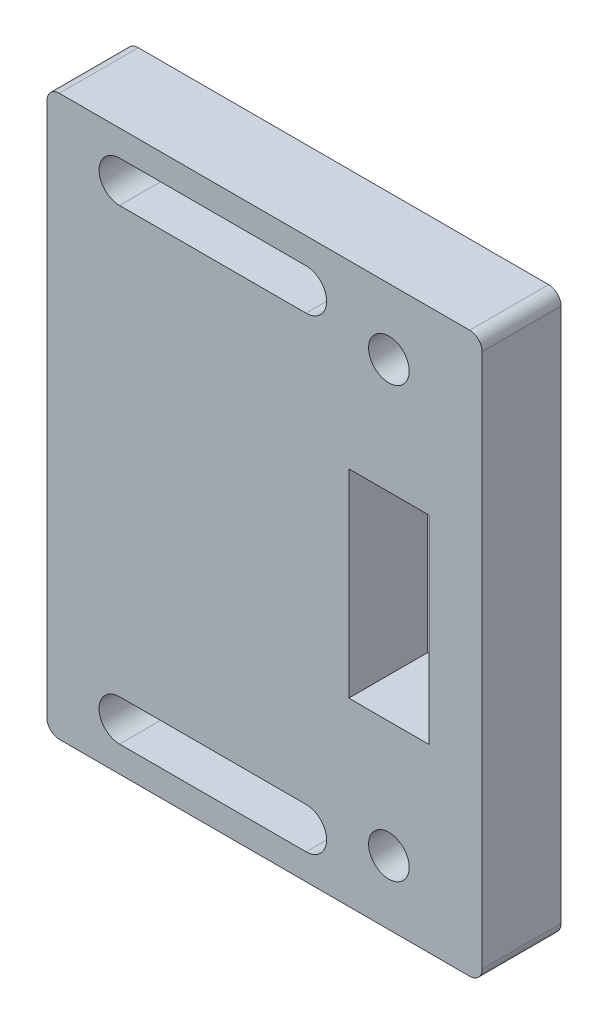
ISO-10303-21;
HEADER;
FILE_DESCRIPTION(('STEP AP214'),'2;1');
FILE_NAME('part.step','',(''),(''),'','','');
FILE_SCHEMA(('AUTOMOTIVE_DESIGN { 1 0 10303 214 1 1 1 1 }'));
ENDSEC;
DATA;
#1=APPLICATION_CONTEXT('core data for automotive mechanical design processes');
#2=APPLICATION_PROTOCOL_DEFINITION('international standard','automotive_design',2000,#1);
#3=PRODUCT_CONTEXT('',#1,'mechanical');
#4=PRODUCT('Part','Part','',(#3));
#5=PRODUCT_RELATED_PRODUCT_CATEGORY('part','',(#4));
#6=PRODUCT_DEFINITION_FORMATION('','',#4);
#7=PRODUCT_DEFINITION_CONTEXT('part definition',#1,'design');
#8=PRODUCT_DEFINITION('design','',#6,#7);
#9=PRODUCT_DEFINITION_SHAPE('','',#8);
#10=(LENGTH_UNIT() NAMED_UNIT(*) SI_UNIT(.MILLI.,.METRE.));
#11=(NAMED_UNIT(*) PLANE_ANGLE_UNIT() SI_UNIT($,.RADIAN.));
#12=(NAMED_UNIT(*) SI_UNIT($,.STERADIAN.) SOLID_ANGLE_UNIT());
#13=UNCERTAINTY_MEASURE_WITH_UNIT(LENGTH_MEASURE(1.E-05),#10,'distance_accuracy_value','');
#14=(GEOMETRIC_REPRESENTATION_CONTEXT(3) GLOBAL_UNCERTAINTY_ASSIGNED_CONTEXT((#13)) GLOBAL_UNIT_ASSIGNED_CONTEXT((#10,
#11,#12)) REPRESENTATION_CONTEXT('',''));
#15=CARTESIAN_POINT('',(0.,0.,0.));
#16=DIRECTION('',(0.,0.,1.));
#17=DIRECTION('',(1.,0.,0.));
#18=AXIS2_PLACEMENT_3D('',#15,#16,#17);
#19=CARTESIAN_POINT('',(0.,0.,12.7));
#20=DIRECTION('',(0.,0.,1.));
#21=DIRECTION('',(1.,0.,0.));
#22=AXIS2_PLACEMENT_3D('',#19,#20,#21);
#23=PLANE('',#22);
#24=DIRECTION('',(1.,0.,0.));
#25=VECTOR('',#24,1.);
#26=CARTESIAN_POINT('',(11.6874699313799,-79.215,12.7));
#27=LINE('',#26,#25);
#28=CARTESIAN_POINT('',(11.6874699313799,-79.215,12.7));
#29=VERTEX_POINT('',#28);
#30=CARTESIAN_POINT('',(41.6874699313799,-79.215,12.7));
#31=VERTEX_POINT('',#30);
#32=EDGE_CURVE('E179',#29,#31,#27,.T.);
#33=ORIENTED_EDGE('',*,*,#32,.T.);
#34=CARTESIAN_POINT('',(41.6874699313799,-82.515,12.7));
#35=DIRECTION('',(0.,0.,-1.));
#36=DIRECTION('',(-1.,0.,0.));
#37=AXIS2_PLACEMENT_3D('',#34,#35,#36);
#38=CIRCLE('',#37,3.3);
#39=CARTESIAN_POINT('',(41.6874699313799,-85.815,12.7));
#40=VERTEX_POINT('',#39);
#41=EDGE_CURVE('E190',#31,#40,#38,.T.);
#42=ORIENTED_EDGE('',*,*,#41,.T.);
#43=DIRECTION('',(-1.,0.,0.));
#44=VECTOR('',#43,1.);
#45=CARTESIAN_POINT('',(41.6874699313799,-85.815,12.7));
#46=LINE('',#45,#44);
#47=CARTESIAN_POINT('',(11.6874699313799,-85.815,12.7));
#48=VERTEX_POINT('',#47);
#49=EDGE_CURVE('E52',#40,#48,#46,.T.);
#50=ORIENTED_EDGE('',*,*,#49,.T.);
#51=CARTESIAN_POINT('',(11.6874699313799,-82.515,12.7));
#52=DIRECTION('',(0.,0.,-1.));
#53=DIRECTION('',(-1.,0.,0.));
#54=AXIS2_PLACEMENT_3D('',#51,#52,#53);
#55=CIRCLE('',#54,3.3);
#56=EDGE_CURVE('E187',#48,#29,#55,.T.);
#57=ORIENTED_EDGE('',*,*,#56,.T.);
#58=EDGE_LOOP('',(#33,#42,#50,#57));
#59=FACE_BOUND('',#58,.T.);
#60=DIRECTION('',(1.,0.,0.));
#61=VECTOR('',#60,1.);
#62=CARTESIAN_POINT('',(11.6874699313799,-4.185,12.7));
#63=LINE('',#62,#61);
#64=CARTESIAN_POINT('',(11.6874699313799,-4.185,12.7));
#65=VERTEX_POINT('',#64);
#66=CARTESIAN_POINT('',(41.6874699313799,-4.185,12.7));
#67=VERTEX_POINT('',#66);
#68=EDGE_CURVE('E229',#65,#67,#63,.T.);
#69=ORIENTED_EDGE('',*,*,#68,.T.);
#70=CARTESIAN_POINT('',(41.6874699313799,-7.485,12.7));
#71=DIRECTION('',(0.,0.,-1.));
#72=DIRECTION('',(-1.,0.,0.));
#73=AXIS2_PLACEMENT_3D('',#70,#71,#72);
#74=CIRCLE('',#73,3.3);
#75=CARTESIAN_POINT('',(41.6874699313799,-10.785,12.7));
#76=VERTEX_POINT('',#75);
#77=EDGE_CURVE('E239',#67,#76,#74,.T.);
#78=ORIENTED_EDGE('',*,*,#77,.T.);
#79=DIRECTION('',(1.,0.,0.));
#80=VECTOR('',#79,1.);
#81=CARTESIAN_POINT('',(11.6874699313799,-10.785,12.7));
#82=LINE('',#81,#80);
#83=CARTESIAN_POINT('',(11.6874699313799,-10.785,12.7));
#84=VERTEX_POINT('',#83);
#85=EDGE_CURVE('E237',#84,#76,#82,.T.);
#86=ORIENTED_EDGE('',*,*,#85,.F.);
#87=CARTESIAN_POINT('',(11.6874699313799,-7.485,12.7));
#88=DIRECTION('',(0.,0.,-1.));
#89=DIRECTION('',(-1.,0.,0.));
#90=AXIS2_PLACEMENT_3D('',#87,#88,#89);
#91=CIRCLE('',#90,3.3);
#92=EDGE_CURVE('E219',#84,#65,#91,.T.);
#93=ORIENTED_EDGE('',*,*,#92,.T.);
#94=EDGE_LOOP('',(#69,#78,#86,#93));
#95=FACE_BOUND('',#94,.T.);
#96=CARTESIAN_POINT('',(55.,-10.5796100233312,12.7));
#97=DIRECTION('',(0.,0.,-1.));
#98=DIRECTION('',(-1.,0.,0.));
#99=AXIS2_PLACEMENT_3D('',#96,#97,#98);
#100=CIRCLE('',#99,3.2639);
#101=CARTESIAN_POINT('',(51.7361,-10.5796100233312,12.7));
#102=VERTEX_POINT('',#101);
#103=EDGE_CURVE('E249',#102,#102,#100,.T.);
#104=ORIENTED_EDGE('',*,*,#103,.T.);
#105=EDGE_LOOP('',(#104));
#106=FACE_BOUND('',#105,.T.);
#107=CARTESIAN_POINT('',(55.,-79.6996100233311,12.7));
#108=DIRECTION('',(0.,0.,-1.));
#109=DIRECTION('',(-1.,0.,0.));
#110=AXIS2_PLACEMENT_3D('',#107,#108,#109);
#111=CIRCLE('',#110,3.2639);
#112=CARTESIAN_POINT('',(51.7361,-79.6996100233311,12.7));
#113=VERTEX_POINT('',#112);
#114=EDGE_CURVE('E258',#113,#113,#111,.T.);
#115=ORIENTED_EDGE('',*,*,#114,.T.);
#116=EDGE_LOOP('',(#115));
#117=FACE_BOUND('',#116,.T.);
#118=DIRECTION('',(-1.,0.,0.));
#119=VECTOR('',#118,1.);
#120=CARTESIAN_POINT('',(0.,0.,12.7));
#121=LINE('',#120,#119);
#122=CARTESIAN_POINT('',(68.,0.,12.7));
#123=VERTEX_POINT('',#122);
#124=CARTESIAN_POINT('',(2.,0.,12.7));
#125=VERTEX_POINT('',#124);
#126=EDGE_CURVE('E302',#123,#125,#121,.T.);
#127=ORIENTED_EDGE('',*,*,#126,.T.);
#128=CARTESIAN_POINT('',(2.,-2.,12.7));
#129=DIRECTION('',(0.,0.,1.));
#130=DIRECTION('',(1.,0.,0.));
#131=AXIS2_PLACEMENT_3D('',#128,#129,#130);
#132=CIRCLE('',#131,2.);
#133=CARTESIAN_POINT('',(0.,-2.,12.7));
#134=VERTEX_POINT('',#133);
#135=EDGE_CURVE('E339',#125,#134,#132,.T.);
#136=ORIENTED_EDGE('',*,*,#135,.T.);
#137=DIRECTION('',(0.,-1.,0.));
#138=VECTOR('',#137,1.);
#139=CARTESIAN_POINT('',(0.,0.,12.7));
#140=LINE('',#139,#138);
#141=CARTESIAN_POINT('',(0.,-88.,12.7));
#142=VERTEX_POINT('',#141);
#143=EDGE_CURVE('E292',#134,#142,#140,.T.);
#144=ORIENTED_EDGE('',*,*,#143,.T.);
#145=CARTESIAN_POINT('',(2.,-88.,12.7));
#146=DIRECTION('',(0.,0.,1.));
#147=DIRECTION('',(1.,0.,0.));
#148=AXIS2_PLACEMENT_3D('',#145,#146,#147);
#149=CIRCLE('',#148,2.);
#150=CARTESIAN_POINT('',(2.,-90.,12.7));
#151=VERTEX_POINT('',#150);
#152=EDGE_CURVE('E335',#142,#151,#149,.T.);
#153=ORIENTED_EDGE('',*,*,#152,.T.);
#154=DIRECTION('',(1.,0.,0.));
#155=VECTOR('',#154,1.);
#156=CARTESIAN_POINT('',(0.,-90.,12.7));
#157=LINE('',#156,#155);
#158=CARTESIAN_POINT('',(68.,-90.,12.7));
#159=VERTEX_POINT('',#158);
#160=EDGE_CURVE('E295',#151,#159,#157,.T.);
#161=ORIENTED_EDGE('',*,*,#160,.T.);
#162=CARTESIAN_POINT('',(68.,-88.,12.7));
#163=DIRECTION('',(0.,0.,1.));
#164=DIRECTION('',(1.,0.,0.));
#165=AXIS2_PLACEMENT_3D('',#162,#163,#164);
#166=CIRCLE('',#165,2.);
#167=CARTESIAN_POINT('',(70.,-88.,12.7));
#168=VERTEX_POINT('',#167);
#169=EDGE_CURVE('E333',#159,#168,#166,.T.);
#170=ORIENTED_EDGE('',*,*,#169,.T.);
#171=DIRECTION('',(0.,1.,0.));
#172=VECTOR('',#171,1.);
#173=CARTESIAN_POINT('',(70.,0.,12.7));
#174=LINE('',#173,#172);
#175=CARTESIAN_POINT('',(70.,-2.,12.7));
#176=VERTEX_POINT('',#175);
#177=EDGE_CURVE('E299',#168,#176,#174,.T.);
#178=ORIENTED_EDGE('',*,*,#177,.T.);
#179=CARTESIAN_POINT('',(68.,-2.,12.7));
#180=DIRECTION('',(0.,0.,1.));
#181=DIRECTION('',(1.,0.,0.));
#182=AXIS2_PLACEMENT_3D('',#179,#180,#181);
#183=CIRCLE('',#182,2.);
#184=EDGE_CURVE('E337',#176,#123,#183,.T.);
#185=ORIENTED_EDGE('',*,*,#184,.T.);
#186=EDGE_LOOP('',(#127,#136,#144,#153,#161,#170,#178,#185));
#187=FACE_BOUND('',#186,.T.);
#188=DIRECTION('',(1.,0.,0.));
#189=VECTOR('',#188,1.);
#190=CARTESIAN_POINT('',(55.,-60.975,12.7));
#191=LINE('',#190,#189);
#192=CARTESIAN_POINT('',(48.55,-60.975,12.7));
#193=VERTEX_POINT('',#192);
#194=CARTESIAN_POINT('',(61.45,-60.975,12.7));
#195=VERTEX_POINT('',#194);
#196=EDGE_CURVE('E267',#193,#195,#191,.T.);
#197=ORIENTED_EDGE('',*,*,#196,.F.);
#198=DIRECTION('',(0.,-1.,0.));
#199=VECTOR('',#198,1.);
#200=CARTESIAN_POINT('',(48.55,-60.975,12.7));
#201=LINE('',#200,#199);
#202=CARTESIAN_POINT('',(48.55,-29.025,12.7));
#203=VERTEX_POINT('',#202);
#204=EDGE_CURVE('E264',#203,#193,#201,.T.);
#205=ORIENTED_EDGE('',*,*,#204,.F.);
#206=DIRECTION('',(-1.,0.,0.));
#207=VECTOR('',#206,1.);
#208=CARTESIAN_POINT('',(48.55,-29.025,12.7));
#209=LINE('',#208,#207);
#210=CARTESIAN_POINT('',(61.45,-29.025,12.7));
#211=VERTEX_POINT('',#210);
#212=EDGE_CURVE('E262',#211,#203,#209,.T.);
#213=ORIENTED_EDGE('',*,*,#212,.F.);
#214=DIRECTION('',(0.,1.,0.));
#215=VECTOR('',#214,1.);
#216=CARTESIAN_POINT('',(61.45,-29.025,12.7));
#217=LINE('',#216,#215);
#218=EDGE_CURVE('E269',#195,#211,#217,.T.);
#219=ORIENTED_EDGE('',*,*,#218,.F.);
#220=EDGE_LOOP('',(#197,#205,#213,#219));
#221=FACE_BOUND('',#220,.T.);
#222=ADVANCED_FACE('F37',(#59,#95,#106,#117,#187,#221),#23,.T.);
#223=CARTESIAN_POINT('',(0.,0.,0.));
#224=DIRECTION('',(0.,0.,1.));
#225=DIRECTION('',(1.,0.,0.));
#226=AXIS2_PLACEMENT_3D('',#223,#224,#225);
#227=PLANE('',#226);
#228=CARTESIAN_POINT('',(41.6874699313799,-82.515,0.));
#229=DIRECTION('',(0.,0.,-1.));
#230=DIRECTION('',(-1.,0.,0.));
#231=AXIS2_PLACEMENT_3D('',#228,#229,#230);
#232=CIRCLE('',#231,3.3);
#233=CARTESIAN_POINT('',(41.6874699313799,-79.215,0.));
#234=VERTEX_POINT('',#233);
#235=CARTESIAN_POINT('',(41.6874699313799,-85.815,0.));
#236=VERTEX_POINT('',#235);
#237=EDGE_CURVE('E205',#234,#236,#232,.T.);
#238=ORIENTED_EDGE('',*,*,#237,.F.);
#239=DIRECTION('',(1.,0.,0.));
#240=VECTOR('',#239,1.);
#241=CARTESIAN_POINT('',(11.6874699313799,-79.215,0.));
#242=LINE('',#241,#240);
#243=CARTESIAN_POINT('',(11.6874699313799,-79.215,0.));
#244=VERTEX_POINT('',#243);
#245=EDGE_CURVE('E182',#244,#234,#242,.T.);
#246=ORIENTED_EDGE('',*,*,#245,.F.);
#247=CARTESIAN_POINT('',(11.6874699313799,-82.515,0.));
#248=DIRECTION('',(0.,0.,-1.));
#249=DIRECTION('',(-1.,0.,0.));
#250=AXIS2_PLACEMENT_3D('',#247,#248,#249);
#251=CIRCLE('',#250,3.3);
#252=CARTESIAN_POINT('',(11.6874699313799,-85.815,0.));
#253=VERTEX_POINT('',#252);
#254=EDGE_CURVE('E196',#253,#244,#251,.T.);
#255=ORIENTED_EDGE('',*,*,#254,.F.);
#256=DIRECTION('',(-1.,0.,0.));
#257=VECTOR('',#256,1.);
#258=CARTESIAN_POINT('',(41.6874699313799,-85.815,0.));
#259=LINE('',#258,#257);
#260=EDGE_CURVE('E199',#236,#253,#259,.T.);
#261=ORIENTED_EDGE('',*,*,#260,.F.);
#262=EDGE_LOOP('',(#238,#246,#255,#261));
#263=FACE_BOUND('',#262,.T.);
#264=CARTESIAN_POINT('',(41.6874699313799,-7.485,0.));
#265=DIRECTION('',(0.,0.,-1.));
#266=DIRECTION('',(-1.,0.,0.));
#267=AXIS2_PLACEMENT_3D('',#264,#265,#266);
#268=CIRCLE('',#267,3.3);
#269=CARTESIAN_POINT('',(41.6874699313799,-4.185,0.));
#270=VERTEX_POINT('',#269);
#271=CARTESIAN_POINT('',(41.6874699313799,-10.785,0.));
#272=VERTEX_POINT('',#271);
#273=EDGE_CURVE('E232',#270,#272,#268,.T.);
#274=ORIENTED_EDGE('',*,*,#273,.F.);
#275=DIRECTION('',(1.,0.,0.));
#276=VECTOR('',#275,1.);
#277=CARTESIAN_POINT('',(11.6874699313799,-4.185,0.));
#278=LINE('',#277,#276);
#279=CARTESIAN_POINT('',(11.6874699313799,-4.185,0.));
#280=VERTEX_POINT('',#279);
#281=EDGE_CURVE('E206',#280,#270,#278,.T.);
#282=ORIENTED_EDGE('',*,*,#281,.F.);
#283=CARTESIAN_POINT('',(11.6874699313799,-7.485,0.));
#284=DIRECTION('',(0.,0.,-1.));
#285=DIRECTION('',(-1.,0.,0.));
#286=AXIS2_PLACEMENT_3D('',#283,#284,#285);
#287=CIRCLE('',#286,3.3);
#288=CARTESIAN_POINT('',(11.6874699313799,-10.785,0.));
#289=VERTEX_POINT('',#288);
#290=EDGE_CURVE('E225',#289,#280,#287,.T.);
#291=ORIENTED_EDGE('',*,*,#290,.F.);
#292=DIRECTION('',(1.,0.,0.));
#293=VECTOR('',#292,1.);
#294=CARTESIAN_POINT('',(11.6874699313799,-10.785,0.));
#295=LINE('',#294,#293);
#296=EDGE_CURVE('E228',#289,#272,#295,.T.);
#297=ORIENTED_EDGE('',*,*,#296,.T.);
#298=EDGE_LOOP('',(#274,#282,#291,#297));
#299=FACE_BOUND('',#298,.T.);
#300=CARTESIAN_POINT('',(55.,-10.5796100233312,0.));
#301=DIRECTION('',(0.,0.,-1.));
#302=DIRECTION('',(-1.,0.,0.));
#303=AXIS2_PLACEMENT_3D('',#300,#301,#302);
#304=CIRCLE('',#303,6.4389);
#305=CARTESIAN_POINT('',(48.5611,-10.5796100233312,0.));
#306=VERTEX_POINT('',#305);
#307=EDGE_CURVE('E212',#306,#306,#304,.T.);
#308=ORIENTED_EDGE('',*,*,#307,.F.);
#309=EDGE_LOOP('',(#308));
#310=FACE_BOUND('',#309,.T.);
#311=CARTESIAN_POINT('',(55.,-79.6996100233311,0.));
#312=DIRECTION('',(0.,0.,-1.));
#313=DIRECTION('',(-1.,0.,0.));
#314=AXIS2_PLACEMENT_3D('',#311,#312,#313);
#315=CIRCLE('',#314,6.4389);
#316=CARTESIAN_POINT('',(48.5611,-79.6996100233311,0.));
#317=VERTEX_POINT('',#316);
#318=EDGE_CURVE('E252',#317,#317,#315,.T.);
#319=ORIENTED_EDGE('',*,*,#318,.F.);
#320=EDGE_LOOP('',(#319));
#321=FACE_BOUND('',#320,.T.);
#322=DIRECTION('',(0.,-1.,0.));
#323=VECTOR('',#322,1.);
#324=CARTESIAN_POINT('',(0.,0.,0.));
#325=LINE('',#324,#323);
#326=CARTESIAN_POINT('',(0.,-2.,0.));
#327=VERTEX_POINT('',#326);
#328=CARTESIAN_POINT('',(0.,-88.,0.));
#329=VERTEX_POINT('',#328);
#330=EDGE_CURVE('E291',#327,#329,#325,.T.);
#331=ORIENTED_EDGE('',*,*,#330,.F.);
#332=CARTESIAN_POINT('',(2.,-2.,0.));
#333=DIRECTION('',(0.,0.,1.));
#334=DIRECTION('',(1.,0.,0.));
#335=AXIS2_PLACEMENT_3D('',#332,#333,#334);
#336=CIRCLE('',#335,2.);
#337=CARTESIAN_POINT('',(2.,0.,0.));
#338=VERTEX_POINT('',#337);
#339=EDGE_CURVE('E326',#327,#338,#336,.F.);
#340=ORIENTED_EDGE('',*,*,#339,.T.);
#341=DIRECTION('',(-1.,0.,0.));
#342=VECTOR('',#341,1.);
#343=CARTESIAN_POINT('',(0.,0.,0.));
#344=LINE('',#343,#342);
#345=CARTESIAN_POINT('',(68.,0.,0.));
#346=VERTEX_POINT('',#345);
#347=EDGE_CURVE('E296',#346,#338,#344,.T.);
#348=ORIENTED_EDGE('',*,*,#347,.F.);
#349=CARTESIAN_POINT('',(68.,-2.,0.));
#350=DIRECTION('',(0.,0.,1.));
#351=DIRECTION('',(1.,0.,0.));
#352=AXIS2_PLACEMENT_3D('',#349,#350,#351);
#353=CIRCLE('',#352,2.);
#354=CARTESIAN_POINT('',(70.,-2.,0.));
#355=VERTEX_POINT('',#354);
#356=EDGE_CURVE('E324',#346,#355,#353,.F.);
#357=ORIENTED_EDGE('',*,*,#356,.T.);
#358=DIRECTION('',(0.,1.,0.));
#359=VECTOR('',#358,1.);
#360=CARTESIAN_POINT('',(70.,0.,0.));
#361=LINE('',#360,#359);
#362=CARTESIAN_POINT('',(70.,-88.,0.));
#363=VERTEX_POINT('',#362);
#364=EDGE_CURVE('E311',#363,#355,#361,.T.);
#365=ORIENTED_EDGE('',*,*,#364,.F.);
#366=CARTESIAN_POINT('',(68.,-88.,0.));
#367=DIRECTION('',(0.,0.,1.));
#368=DIRECTION('',(1.,0.,0.));
#369=AXIS2_PLACEMENT_3D('',#366,#367,#368);
#370=CIRCLE('',#369,2.);
#371=CARTESIAN_POINT('',(68.,-90.,0.));
#372=VERTEX_POINT('',#371);
#373=EDGE_CURVE('E320',#363,#372,#370,.F.);
#374=ORIENTED_EDGE('',*,*,#373,.T.);
#375=DIRECTION('',(1.,0.,0.));
#376=VECTOR('',#375,1.);
#377=CARTESIAN_POINT('',(0.,-90.,0.));
#378=LINE('',#377,#376);
#379=CARTESIAN_POINT('',(2.,-90.,0.));
#380=VERTEX_POINT('',#379);
#381=EDGE_CURVE('E308',#380,#372,#378,.T.);
#382=ORIENTED_EDGE('',*,*,#381,.F.);
#383=CARTESIAN_POINT('',(2.,-88.,0.));
#384=DIRECTION('',(0.,0.,1.));
#385=DIRECTION('',(1.,0.,0.));
#386=AXIS2_PLACEMENT_3D('',#383,#384,#385);
#387=CIRCLE('',#386,2.);
#388=EDGE_CURVE('E322',#380,#329,#387,.F.);
#389=ORIENTED_EDGE('',*,*,#388,.T.);
#390=EDGE_LOOP('',(#331,#340,#348,#357,#365,#374,#382,#389));
#391=FACE_BOUND('',#390,.T.);
#392=DIRECTION('',(0.,-1.,0.));
#393=VECTOR('',#392,1.);
#394=CARTESIAN_POINT('',(48.55,-60.975,0.));
#395=LINE('',#394,#393);
#396=CARTESIAN_POINT('',(48.55,-29.025,0.));
#397=VERTEX_POINT('',#396);
#398=CARTESIAN_POINT('',(48.55,-60.975,0.));
#399=VERTEX_POINT('',#398);
#400=EDGE_CURVE('E261',#397,#399,#395,.T.);
#401=ORIENTED_EDGE('',*,*,#400,.T.);
#402=DIRECTION('',(1.,0.,0.));
#403=VECTOR('',#402,1.);
#404=CARTESIAN_POINT('',(61.45,-60.975,0.));
#405=LINE('',#404,#403);
#406=CARTESIAN_POINT('',(61.45,-60.975,0.));
#407=VERTEX_POINT('',#406);
#408=EDGE_CURVE('E275',#399,#407,#405,.T.);
#409=ORIENTED_EDGE('',*,*,#408,.T.);
#410=DIRECTION('',(0.,1.,0.));
#411=VECTOR('',#410,1.);
#412=CARTESIAN_POINT('',(61.45,-29.025,0.));
#413=LINE('',#412,#411);
#414=CARTESIAN_POINT('',(61.45,-29.025,0.));
#415=VERTEX_POINT('',#414);
#416=EDGE_CURVE('E278',#407,#415,#413,.T.);
#417=ORIENTED_EDGE('',*,*,#416,.T.);
#418=DIRECTION('',(-1.,0.,0.));
#419=VECTOR('',#418,1.);
#420=CARTESIAN_POINT('',(55.,-29.025,0.));
#421=LINE('',#420,#419);
#422=EDGE_CURVE('E265',#415,#397,#421,.T.);
#423=ORIENTED_EDGE('',*,*,#422,.T.);
#424=EDGE_LOOP('',(#401,#409,#417,#423));
#425=FACE_BOUND('',#424,.T.);
#426=ADVANCED_FACE('F364',(#263,#299,#310,#321,#391,#425),#227,.F.);
#427=CARTESIAN_POINT('',(0.,0.,12.7));
#428=DIRECTION('',(1.,0.,0.));
#429=DIRECTION('',(0.,0.,-1.));
#430=AXIS2_PLACEMENT_3D('',#427,#428,#429);
#431=PLANE('',#430);
#432=ORIENTED_EDGE('',*,*,#143,.F.);
#433=DIRECTION('',(0.,0.,-1.));
#434=VECTOR('',#433,1.);
#435=CARTESIAN_POINT('',(0.,-2.,12.7));
#436=LINE('',#435,#434);
#437=EDGE_CURVE('E317',#134,#327,#436,.T.);
#438=ORIENTED_EDGE('',*,*,#437,.T.);
#439=ORIENTED_EDGE('',*,*,#330,.T.);
#440=DIRECTION('',(0.,0.,-1.));
#441=VECTOR('',#440,1.);
#442=CARTESIAN_POINT('',(0.,-88.,12.7));
#443=LINE('',#442,#441);
#444=EDGE_CURVE('E305',#329,#142,#443,.F.);
#445=ORIENTED_EDGE('',*,*,#444,.T.);
#446=EDGE_LOOP('',(#432,#438,#439,#445));
#447=FACE_BOUND('',#446,.T.);
#448=ADVANCED_FACE('F381',(#447),#431,.F.);
#449=CARTESIAN_POINT('',(0.,-90.,12.7));
#450=DIRECTION('',(0.,1.,0.));
#451=DIRECTION('',(-1.,0.,0.));
#452=AXIS2_PLACEMENT_3D('',#449,#450,#451);
#453=PLANE('',#452);
#454=ORIENTED_EDGE('',*,*,#160,.F.);
#455=DIRECTION('',(0.,0.,-1.));
#456=VECTOR('',#455,1.);
#457=CARTESIAN_POINT('',(2.,-90.,12.7));
#458=LINE('',#457,#456);
#459=EDGE_CURVE('E11',#151,#380,#458,.T.);
#460=ORIENTED_EDGE('',*,*,#459,.T.);
#461=ORIENTED_EDGE('',*,*,#381,.T.);
#462=DIRECTION('',(0.,0.,-1.));
#463=VECTOR('',#462,1.);
#464=CARTESIAN_POINT('',(68.,-90.,12.7));
#465=LINE('',#464,#463);
#466=EDGE_CURVE('E45',#372,#159,#465,.F.);
#467=ORIENTED_EDGE('',*,*,#466,.T.);
#468=EDGE_LOOP('',(#454,#460,#461,#467));
#469=FACE_BOUND('',#468,.T.);
#470=ADVANCED_FACE('F348',(#469),#453,.F.);
#471=CARTESIAN_POINT('',(70.,0.,12.7));
#472=DIRECTION('',(-1.,0.,0.));
#473=DIRECTION('',(0.,-1.,0.));
#474=AXIS2_PLACEMENT_3D('',#471,#472,#473);
#475=PLANE('',#474);
#476=ORIENTED_EDGE('',*,*,#364,.T.);
#477=DIRECTION('',(0.,0.,-1.));
#478=VECTOR('',#477,1.);
#479=CARTESIAN_POINT('',(70.,-2.,12.7));
#480=LINE('',#479,#478);
#481=EDGE_CURVE('E344',#355,#176,#480,.F.);
#482=ORIENTED_EDGE('',*,*,#481,.T.);
#483=ORIENTED_EDGE('',*,*,#177,.F.);
#484=DIRECTION('',(0.,0.,-1.));
#485=VECTOR('',#484,1.);
#486=CARTESIAN_POINT('',(70.,-88.,12.7));
#487=LINE('',#486,#485);
#488=EDGE_CURVE('E341',#168,#363,#487,.T.);
#489=ORIENTED_EDGE('',*,*,#488,.T.);
#490=EDGE_LOOP('',(#476,#482,#483,#489));
#491=FACE_BOUND('',#490,.T.);
#492=ADVANCED_FACE('F360',(#491),#475,.F.);
#493=CARTESIAN_POINT('',(0.,0.,12.7));
#494=DIRECTION('',(0.,-1.,0.));
#495=DIRECTION('',(0.,0.,-1.));
#496=AXIS2_PLACEMENT_3D('',#493,#494,#495);
#497=PLANE('',#496);
#498=ORIENTED_EDGE('',*,*,#347,.T.);
#499=DIRECTION('',(0.,0.,-1.));
#500=VECTOR('',#499,1.);
#501=CARTESIAN_POINT('',(2.,0.,12.7));
#502=LINE('',#501,#500);
#503=EDGE_CURVE('E331',#338,#125,#502,.F.);
#504=ORIENTED_EDGE('',*,*,#503,.T.);
#505=ORIENTED_EDGE('',*,*,#126,.F.);
#506=DIRECTION('',(0.,0.,-1.));
#507=VECTOR('',#506,1.);
#508=CARTESIAN_POINT('',(68.,0.,12.7));
#509=LINE('',#508,#507);
#510=EDGE_CURVE('E328',#123,#346,#509,.T.);
#511=ORIENTED_EDGE('',*,*,#510,.T.);
#512=EDGE_LOOP('',(#498,#504,#505,#511));
#513=FACE_BOUND('',#512,.T.);
#514=ADVANCED_FACE('F373',(#513),#497,.F.);
#515=CARTESIAN_POINT('',(48.55,-60.975,12.7));
#516=DIRECTION('',(1.,0.,0.));
#517=DIRECTION('',(0.,0.,-1.));
#518=AXIS2_PLACEMENT_3D('',#515,#516,#517);
#519=PLANE('',#518);
#520=ORIENTED_EDGE('',*,*,#400,.F.);
#521=DIRECTION('',(0.,0.,-1.));
#522=VECTOR('',#521,1.);
#523=CARTESIAN_POINT('',(48.55,-29.025,12.7));
#524=LINE('',#523,#522);
#525=EDGE_CURVE('E289',#203,#397,#524,.T.);
#526=ORIENTED_EDGE('',*,*,#525,.F.);
#527=ORIENTED_EDGE('',*,*,#204,.T.);
#528=DIRECTION('',(0.,0.,-1.));
#529=VECTOR('',#528,1.);
#530=CARTESIAN_POINT('',(48.55,-60.975,12.7));
#531=LINE('',#530,#529);
#532=EDGE_CURVE('E286',#193,#399,#531,.T.);
#533=ORIENTED_EDGE('',*,*,#532,.T.);
#534=EDGE_LOOP('',(#520,#526,#527,#533));
#535=FACE_BOUND('',#534,.T.);
#536=ADVANCED_FACE('F400',(#535),#519,.T.);
#537=CARTESIAN_POINT('',(61.45,-60.975,12.7));
#538=DIRECTION('',(0.,1.,0.));
#539=DIRECTION('',(-1.,0.,0.));
#540=AXIS2_PLACEMENT_3D('',#537,#538,#539);
#541=PLANE('',#540);
#542=ORIENTED_EDGE('',*,*,#408,.F.);
#543=ORIENTED_EDGE('',*,*,#532,.F.);
#544=ORIENTED_EDGE('',*,*,#196,.T.);
#545=DIRECTION('',(0.,0.,-1.));
#546=VECTOR('',#545,1.);
#547=CARTESIAN_POINT('',(61.45,-60.975,12.7));
#548=LINE('',#547,#546);
#549=EDGE_CURVE('E284',#195,#407,#548,.T.);
#550=ORIENTED_EDGE('',*,*,#549,.T.);
#551=EDGE_LOOP('',(#542,#543,#544,#550));
#552=FACE_BOUND('',#551,.T.);
#553=ADVANCED_FACE('F444',(#552),#541,.T.);
#554=CARTESIAN_POINT('',(61.45,-29.025,12.7));
#555=DIRECTION('',(-1.,0.,0.));
#556=DIRECTION('',(0.,-1.,0.));
#557=AXIS2_PLACEMENT_3D('',#554,#555,#556);
#558=PLANE('',#557);
#559=ORIENTED_EDGE('',*,*,#416,.F.);
#560=ORIENTED_EDGE('',*,*,#549,.F.);
#561=ORIENTED_EDGE('',*,*,#218,.T.);
#562=DIRECTION('',(0.,0.,-1.));
#563=VECTOR('',#562,1.);
#564=CARTESIAN_POINT('',(61.45,-29.025,12.7));
#565=LINE('',#564,#563);
#566=EDGE_CURVE('E272',#211,#415,#565,.T.);
#567=ORIENTED_EDGE('',*,*,#566,.T.);
#568=EDGE_LOOP('',(#559,#560,#561,#567));
#569=FACE_BOUND('',#568,.T.);
#570=ADVANCED_FACE('F441',(#569),#558,.T.);
#571=CARTESIAN_POINT('',(55.,-29.025,12.7));
#572=DIRECTION('',(0.,-1.,0.));
#573=DIRECTION('',(0.,0.,-1.));
#574=AXIS2_PLACEMENT_3D('',#571,#572,#573);
#575=PLANE('',#574);
#576=ORIENTED_EDGE('',*,*,#422,.F.);
#577=ORIENTED_EDGE('',*,*,#566,.F.);
#578=ORIENTED_EDGE('',*,*,#212,.T.);
#579=ORIENTED_EDGE('',*,*,#525,.T.);
#580=EDGE_LOOP('',(#576,#577,#578,#579));
#581=FACE_BOUND('',#580,.T.);
#582=ADVANCED_FACE('F437',(#581),#575,.T.);
#583=CARTESIAN_POINT('',(55.,-79.6996100233311,0.));
#584=DIRECTION('',(0.,0.,-1.));
#585=DIRECTION('',(-1.,0.,0.));
#586=AXIS2_PLACEMENT_3D('',#583,#584,#585);
#587=CYLINDRICAL_SURFACE('',#586,3.26389999999999);
#588=ORIENTED_EDGE('',*,*,#114,.F.);
#589=EDGE_LOOP('',(#588));
#590=FACE_BOUND('',#589,.T.);
#591=CARTESIAN_POINT('',(55.,-79.6996100233311,3.65241969292671));
#592=DIRECTION('',(0.,0.,-1.));
#593=DIRECTION('',(-1.,0.,0.));
#594=AXIS2_PLACEMENT_3D('',#591,#592,#593);
#595=CIRCLE('',#594,3.26389999999999);
#596=CARTESIAN_POINT('',(51.7361,-79.6996100233311,3.65241969292671));
#597=VERTEX_POINT('',#596);
#598=EDGE_CURVE('E255',#597,#597,#595,.T.);
#599=ORIENTED_EDGE('',*,*,#598,.T.);
#600=EDGE_LOOP('',(#599));
#601=FACE_BOUND('',#600,.T.);
#602=ADVANCED_FACE('F433',(#590,#601),#587,.F.);
#603=CARTESIAN_POINT('',(55.,-79.6996100233311,0.));
#604=DIRECTION('',(0.,0.,-1.));
#605=DIRECTION('',(-1.,0.,0.));
#606=AXIS2_PLACEMENT_3D('',#603,#604,#605);
#607=CONICAL_SURFACE('',#606,6.4389,0.715584993317678);
#608=ORIENTED_EDGE('',*,*,#598,.F.);
#609=EDGE_LOOP('',(#608));
#610=FACE_BOUND('',#609,.T.);
#611=ORIENTED_EDGE('',*,*,#318,.T.);
#612=EDGE_LOOP('',(#611));
#613=FACE_BOUND('',#612,.T.);
#614=ADVANCED_FACE('F422',(#610,#613),#607,.F.);
#615=CARTESIAN_POINT('',(55.,-10.5796100233312,0.));
#616=DIRECTION('',(0.,0.,-1.));
#617=DIRECTION('',(-1.,0.,0.));
#618=AXIS2_PLACEMENT_3D('',#615,#616,#617);
#619=CYLINDRICAL_SURFACE('',#618,3.26389999999999);
#620=ORIENTED_EDGE('',*,*,#103,.F.);
#621=EDGE_LOOP('',(#620));
#622=FACE_BOUND('',#621,.T.);
#623=CARTESIAN_POINT('',(55.,-10.5796100233312,3.65241969292671));
#624=DIRECTION('',(0.,0.,-1.));
#625=DIRECTION('',(-1.,0.,0.));
#626=AXIS2_PLACEMENT_3D('',#623,#624,#625);
#627=CIRCLE('',#626,3.26389999999999);
#628=CARTESIAN_POINT('',(51.7361,-10.5796100233312,3.65241969292671));
#629=VERTEX_POINT('',#628);
#630=EDGE_CURVE('E246',#629,#629,#627,.T.);
#631=ORIENTED_EDGE('',*,*,#630,.T.);
#632=EDGE_LOOP('',(#631));
#633=FACE_BOUND('',#632,.T.);
#634=ADVANCED_FACE('F416',(#622,#633),#619,.F.);
#635=CARTESIAN_POINT('',(55.,-10.5796100233312,0.));
#636=DIRECTION('',(0.,0.,-1.));
#637=DIRECTION('',(-1.,0.,0.));
#638=AXIS2_PLACEMENT_3D('',#635,#636,#637);
#639=CONICAL_SURFACE('',#638,6.4389,0.715584993317678);
#640=ORIENTED_EDGE('',*,*,#630,.F.);
#641=EDGE_LOOP('',(#640));
#642=FACE_BOUND('',#641,.T.);
#643=ORIENTED_EDGE('',*,*,#307,.T.);
#644=EDGE_LOOP('',(#643));
#645=FACE_BOUND('',#644,.T.);
#646=ADVANCED_FACE('F412',(#642,#645),#639,.F.);
#647=CARTESIAN_POINT('',(2.,-2.,12.7));
#648=DIRECTION('',(0.,0.,-1.));
#649=DIRECTION('',(-1.,0.,0.));
#650=AXIS2_PLACEMENT_3D('',#647,#648,#649);
#651=CYLINDRICAL_SURFACE('',#650,2.);
#652=ORIENTED_EDGE('',*,*,#135,.F.);
#653=ORIENTED_EDGE('',*,*,#503,.F.);
#654=ORIENTED_EDGE('',*,*,#339,.F.);
#655=ORIENTED_EDGE('',*,*,#437,.F.);
#656=EDGE_LOOP('',(#652,#653,#654,#655));
#657=FACE_BOUND('',#656,.T.);
#658=ADVANCED_FACE('F379',(#657),#651,.T.);
#659=CARTESIAN_POINT('',(68.,-2.,12.7));
#660=DIRECTION('',(0.,0.,-1.));
#661=DIRECTION('',(-1.,0.,0.));
#662=AXIS2_PLACEMENT_3D('',#659,#660,#661);
#663=CYLINDRICAL_SURFACE('',#662,2.);
#664=ORIENTED_EDGE('',*,*,#184,.F.);
#665=ORIENTED_EDGE('',*,*,#481,.F.);
#666=ORIENTED_EDGE('',*,*,#356,.F.);
#667=ORIENTED_EDGE('',*,*,#510,.F.);
#668=EDGE_LOOP('',(#664,#665,#666,#667));
#669=FACE_BOUND('',#668,.T.);
#670=ADVANCED_FACE('F370',(#669),#663,.T.);
#671=CARTESIAN_POINT('',(2.,-88.,12.7));
#672=DIRECTION('',(0.,0.,-1.));
#673=DIRECTION('',(-1.,0.,0.));
#674=AXIS2_PLACEMENT_3D('',#671,#672,#673);
#675=CYLINDRICAL_SURFACE('',#674,2.);
#676=ORIENTED_EDGE('',*,*,#152,.F.);
#677=ORIENTED_EDGE('',*,*,#444,.F.);
#678=ORIENTED_EDGE('',*,*,#388,.F.);
#679=ORIENTED_EDGE('',*,*,#459,.F.);
#680=EDGE_LOOP('',(#676,#677,#678,#679));
#681=FACE_BOUND('',#680,.T.);
#682=ADVANCED_FACE('F384',(#681),#675,.T.);
#683=CARTESIAN_POINT('',(68.,-88.,12.7));
#684=DIRECTION('',(0.,0.,-1.));
#685=DIRECTION('',(-1.,0.,0.));
#686=AXIS2_PLACEMENT_3D('',#683,#684,#685);
#687=CYLINDRICAL_SURFACE('',#686,2.);
#688=ORIENTED_EDGE('',*,*,#169,.F.);
#689=ORIENTED_EDGE('',*,*,#466,.F.);
#690=ORIENTED_EDGE('',*,*,#373,.F.);
#691=ORIENTED_EDGE('',*,*,#488,.F.);
#692=EDGE_LOOP('',(#688,#689,#690,#691));
#693=FACE_BOUND('',#692,.T.);
#694=ADVANCED_FACE('F39',(#693),#687,.T.);
#695=CARTESIAN_POINT('',(11.6874699313799,-4.185,12.7));
#696=DIRECTION('',(0.,1.,0.));
#697=DIRECTION('',(0.,0.,1.));
#698=AXIS2_PLACEMENT_3D('',#695,#696,#697);
#699=PLANE('',#698);
#700=ORIENTED_EDGE('',*,*,#281,.T.);
#701=DIRECTION('',(0.,0.,-1.));
#702=VECTOR('',#701,1.);
#703=CARTESIAN_POINT('',(41.6874699313799,-4.185,12.7));
#704=LINE('',#703,#702);
#705=EDGE_CURVE('E216',#67,#270,#704,.T.);
#706=ORIENTED_EDGE('',*,*,#705,.F.);
#707=ORIENTED_EDGE('',*,*,#68,.F.);
#708=DIRECTION('',(0.,0.,-1.));
#709=VECTOR('',#708,1.);
#710=CARTESIAN_POINT('',(11.6874699313799,-4.185,12.7));
#711=LINE('',#710,#709);
#712=EDGE_CURVE('E223',#65,#280,#711,.T.);
#713=ORIENTED_EDGE('',*,*,#712,.T.);
#714=EDGE_LOOP('',(#700,#706,#707,#713));
#715=FACE_BOUND('',#714,.T.);
#716=ADVANCED_FACE('F390',(#715),#699,.F.);
#717=CARTESIAN_POINT('',(11.6874699313799,-7.485,12.7));
#718=DIRECTION('',(0.,0.,-1.));
#719=DIRECTION('',(-1.,0.,0.));
#720=AXIS2_PLACEMENT_3D('',#717,#718,#719);
#721=CYLINDRICAL_SURFACE('',#720,3.3);
#722=ORIENTED_EDGE('',*,*,#290,.T.);
#723=ORIENTED_EDGE('',*,*,#712,.F.);
#724=ORIENTED_EDGE('',*,*,#92,.F.);
#725=DIRECTION('',(0.,0.,-1.));
#726=VECTOR('',#725,1.);
#727=CARTESIAN_POINT('',(11.6874699313799,-10.785,12.7));
#728=LINE('',#727,#726);
#729=EDGE_CURVE('E221',#84,#289,#728,.T.);
#730=ORIENTED_EDGE('',*,*,#729,.T.);
#731=EDGE_LOOP('',(#722,#723,#724,#730));
#732=FACE_BOUND('',#731,.T.);
#733=ADVANCED_FACE('F428',(#732),#721,.F.);
#734=CARTESIAN_POINT('',(11.6874699313799,-10.785,12.7));
#735=DIRECTION('',(0.,1.,0.));
#736=DIRECTION('',(0.,0.,1.));
#737=AXIS2_PLACEMENT_3D('',#734,#735,#736);
#738=PLANE('',#737);
#739=ORIENTED_EDGE('',*,*,#296,.F.);
#740=ORIENTED_EDGE('',*,*,#729,.F.);
#741=ORIENTED_EDGE('',*,*,#85,.T.);
#742=DIRECTION('',(0.,0.,-1.));
#743=VECTOR('',#742,1.);
#744=CARTESIAN_POINT('',(41.6874699313799,-10.785,12.7));
#745=LINE('',#744,#743);
#746=EDGE_CURVE('E60',#76,#272,#745,.T.);
#747=ORIENTED_EDGE('',*,*,#746,.T.);
#748=EDGE_LOOP('',(#739,#740,#741,#747));
#749=FACE_BOUND('',#748,.T.);
#750=ADVANCED_FACE('F506',(#749),#738,.T.);
#751=CARTESIAN_POINT('',(41.6874699313799,-7.485,12.7));
#752=DIRECTION('',(0.,0.,-1.));
#753=DIRECTION('',(-1.,0.,0.));
#754=AXIS2_PLACEMENT_3D('',#751,#752,#753);
#755=CYLINDRICAL_SURFACE('',#754,3.3);
#756=ORIENTED_EDGE('',*,*,#273,.T.);
#757=ORIENTED_EDGE('',*,*,#746,.F.);
#758=ORIENTED_EDGE('',*,*,#77,.F.);
#759=ORIENTED_EDGE('',*,*,#705,.T.);
#760=EDGE_LOOP('',(#756,#757,#758,#759));
#761=FACE_BOUND('',#760,.T.);
#762=ADVANCED_FACE('F515',(#761),#755,.F.);
#763=CARTESIAN_POINT('',(11.6874699313799,-79.215,12.7));
#764=DIRECTION('',(0.,1.,0.));
#765=DIRECTION('',(0.,0.,1.));
#766=AXIS2_PLACEMENT_3D('',#763,#764,#765);
#767=PLANE('',#766);
#768=ORIENTED_EDGE('',*,*,#245,.T.);
#769=DIRECTION('',(0.,0.,-1.));
#770=VECTOR('',#769,1.);
#771=CARTESIAN_POINT('',(41.6874699313799,-79.215,12.7));
#772=LINE('',#771,#770);
#773=EDGE_CURVE('E175',#31,#234,#772,.T.);
#774=ORIENTED_EDGE('',*,*,#773,.F.);
#775=ORIENTED_EDGE('',*,*,#32,.F.);
#776=DIRECTION('',(0.,0.,-1.));
#777=VECTOR('',#776,1.);
#778=CARTESIAN_POINT('',(11.6874699313799,-79.215,12.7));
#779=LINE('',#778,#777);
#780=EDGE_CURVE('E210',#29,#244,#779,.T.);
#781=ORIENTED_EDGE('',*,*,#780,.T.);
#782=EDGE_LOOP('',(#768,#774,#775,#781));
#783=FACE_BOUND('',#782,.T.);
#784=ADVANCED_FACE('F177',(#783),#767,.F.);
#785=CARTESIAN_POINT('',(11.6874699313799,-82.515,12.7));
#786=DIRECTION('',(0.,0.,-1.));
#787=DIRECTION('',(-1.,0.,0.));
#788=AXIS2_PLACEMENT_3D('',#785,#786,#787);
#789=CYLINDRICAL_SURFACE('',#788,3.3);
#790=ORIENTED_EDGE('',*,*,#254,.T.);
#791=ORIENTED_EDGE('',*,*,#780,.F.);
#792=ORIENTED_EDGE('',*,*,#56,.F.);
#793=DIRECTION('',(0.,0.,-1.));
#794=VECTOR('',#793,1.);
#795=CARTESIAN_POINT('',(11.6874699313799,-85.815,12.7));
#796=LINE('',#795,#794);
#797=EDGE_CURVE('E213',#48,#253,#796,.T.);
#798=ORIENTED_EDGE('',*,*,#797,.T.);
#799=EDGE_LOOP('',(#790,#791,#792,#798));
#800=FACE_BOUND('',#799,.T.);
#801=ADVANCED_FACE('F532',(#800),#789,.F.);
#802=CARTESIAN_POINT('',(41.6874699313799,-85.815,12.7));
#803=DIRECTION('',(0.,-1.,0.));
#804=DIRECTION('',(0.,0.,-1.));
#805=AXIS2_PLACEMENT_3D('',#802,#803,#804);
#806=PLANE('',#805);
#807=ORIENTED_EDGE('',*,*,#260,.T.);
#808=ORIENTED_EDGE('',*,*,#797,.F.);
#809=ORIENTED_EDGE('',*,*,#49,.F.);
#810=DIRECTION('',(0.,0.,-1.));
#811=VECTOR('',#810,1.);
#812=CARTESIAN_POINT('',(41.6874699313799,-85.815,12.7));
#813=LINE('',#812,#811);
#814=EDGE_CURVE('E186',#40,#236,#813,.T.);
#815=ORIENTED_EDGE('',*,*,#814,.T.);
#816=EDGE_LOOP('',(#807,#808,#809,#815));
#817=FACE_BOUND('',#816,.T.);
#818=ADVANCED_FACE('F541',(#817),#806,.F.);
#819=CARTESIAN_POINT('',(41.6874699313799,-82.515,12.7));
#820=DIRECTION('',(0.,0.,-1.));
#821=DIRECTION('',(-1.,0.,0.));
#822=AXIS2_PLACEMENT_3D('',#819,#820,#821);
#823=CYLINDRICAL_SURFACE('',#822,3.3);
#824=ORIENTED_EDGE('',*,*,#237,.T.);
#825=ORIENTED_EDGE('',*,*,#814,.F.);
#826=ORIENTED_EDGE('',*,*,#41,.F.);
#827=ORIENTED_EDGE('',*,*,#773,.T.);
#828=EDGE_LOOP('',(#824,#825,#826,#827));
#829=FACE_BOUND('',#828,.T.);
#830=ADVANCED_FACE('F191',(#829),#823,.F.);
#831=CLOSED_SHELL('',(#222,#426,#448,#470,#492,#514,#536,#553,#570,#582,#602,#614,#634,#646,
#658,#670,#682,#694,#716,#733,#750,#762,#784,#801,#818,#830));
#832=MANIFOLD_SOLID_BREP('B2',#831);
#833=ADVANCED_BREP_SHAPE_REPRESENTATION('',(#18,#832),#14);
#834=SHAPE_DEFINITION_REPRESENTATION(#9,#833);
ENDSEC;
END-ISO-10303-21;
